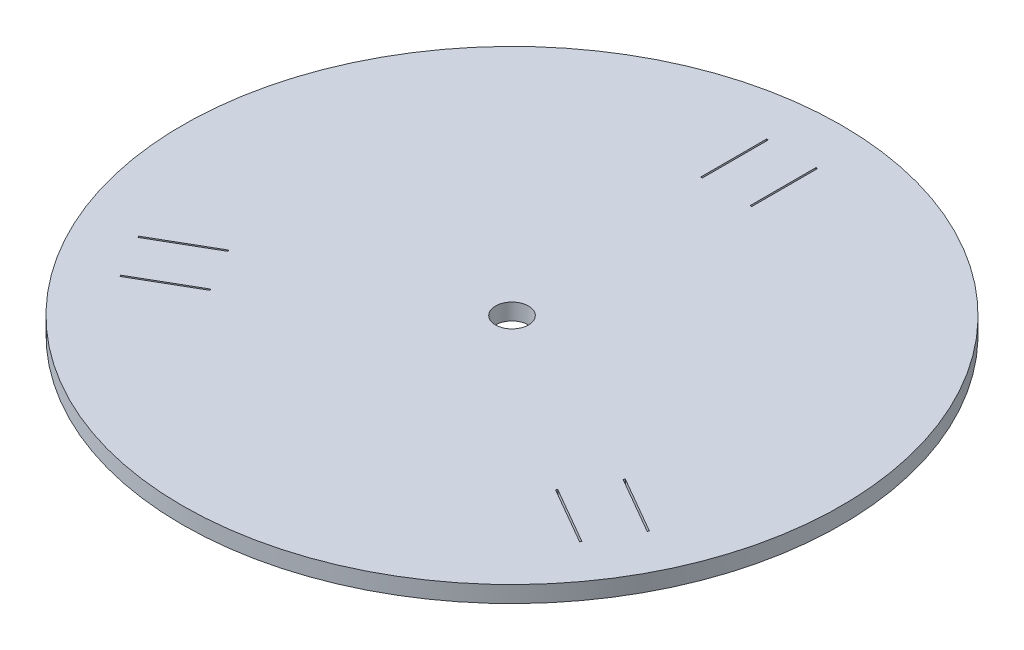
ISO-10303-21;
HEADER;
FILE_DESCRIPTION(('STEP AP214'),'2;1');
FILE_NAME('part.step','',(''),(''),'','','');
FILE_SCHEMA(('AUTOMOTIVE_DESIGN { 1 0 10303 214 1 1 1 1 }'));
ENDSEC;
DATA;
#1=APPLICATION_CONTEXT('core data for automotive mechanical design processes');
#2=APPLICATION_PROTOCOL_DEFINITION('international standard','automotive_design',2000,#1);
#3=PRODUCT_CONTEXT('',#1,'mechanical');
#4=PRODUCT('Part','Part','',(#3));
#5=PRODUCT_RELATED_PRODUCT_CATEGORY('part','',(#4));
#6=PRODUCT_DEFINITION_FORMATION('','',#4);
#7=PRODUCT_DEFINITION_CONTEXT('part definition',#1,'design');
#8=PRODUCT_DEFINITION('design','',#6,#7);
#9=PRODUCT_DEFINITION_SHAPE('','',#8);
#10=(LENGTH_UNIT() NAMED_UNIT(*) SI_UNIT(.MILLI.,.METRE.));
#11=(NAMED_UNIT(*) PLANE_ANGLE_UNIT() SI_UNIT($,.RADIAN.));
#12=(NAMED_UNIT(*) SI_UNIT($,.STERADIAN.) SOLID_ANGLE_UNIT());
#13=UNCERTAINTY_MEASURE_WITH_UNIT(LENGTH_MEASURE(1.E-05),#10,'distance_accuracy_value','');
#14=(GEOMETRIC_REPRESENTATION_CONTEXT(3) GLOBAL_UNCERTAINTY_ASSIGNED_CONTEXT((#13)) GLOBAL_UNIT_ASSIGNED_CONTEXT((#10,
#11,#12)) REPRESENTATION_CONTEXT('',''));
#15=CARTESIAN_POINT('',(0.,0.,0.));
#16=DIRECTION('',(0.,0.,1.));
#17=DIRECTION('',(1.,0.,0.));
#18=AXIS2_PLACEMENT_3D('',#15,#16,#17);
#19=CARTESIAN_POINT('',(0.,5.,0.));
#20=DIRECTION('',(0.,1.,0.));
#21=DIRECTION('',(0.,0.,1.));
#22=AXIS2_PLACEMENT_3D('',#19,#20,#21);
#23=PLANE('',#22);
#24=CARTESIAN_POINT('',(0.,5.,0.));
#25=DIRECTION('',(0.,1.,0.));
#26=DIRECTION('',(0.,0.,1.));
#27=AXIS2_PLACEMENT_3D('',#24,#25,#26);
#28=CIRCLE('',#27,100.);
#29=CARTESIAN_POINT('',(0.,5.,100.));
#30=VERTEX_POINT('',#29);
#31=EDGE_CURVE('E11',#30,#30,#28,.T.);
#32=ORIENTED_EDGE('',*,*,#31,.T.);
#33=EDGE_LOOP('',(#32));
#34=FACE_BOUND('',#33,.T.);
#35=DIRECTION('',(0.500000000000005,0.,-0.866025403784436));
#36=VECTOR('',#35,1.);
#37=CARTESIAN_POINT('',(77.4871593216773,5.,35.7883031206706));
#38=LINE('',#37,#36);
#39=CARTESIAN_POINT('',(77.2371593216773,5.,36.2213158225628));
#40=VERTEX_POINT('',#39);
#41=CARTESIAN_POINT('',(77.4871593216773,5.,35.7883031206706));
#42=VERTEX_POINT('',#41);
#43=EDGE_CURVE('E264',#40,#42,#38,.T.);
#44=ORIENTED_EDGE('',*,*,#43,.F.);
#45=DIRECTION('',(0.866025403784439,0.,0.5));
#46=VECTOR('',#45,1.);
#47=CARTESIAN_POINT('',(59.9166512459885,5.,26.2213158225628));
#48=LINE('',#47,#46);
#49=CARTESIAN_POINT('',(59.9166512459885,5.,26.2213158225628));
#50=VERTEX_POINT('',#49);
#51=EDGE_CURVE('E370',#50,#40,#48,.T.);
#52=ORIENTED_EDGE('',*,*,#51,.F.);
#53=DIRECTION('',(-0.500000000000002,0.,0.866025403784438));
#54=VECTOR('',#53,1.);
#55=CARTESIAN_POINT('',(60.1666512459885,5.,25.7883031206706));
#56=LINE('',#55,#54);
#57=CARTESIAN_POINT('',(60.1666512459885,5.,25.7883031206706));
#58=VERTEX_POINT('',#57);
#59=EDGE_CURVE('E384',#58,#50,#56,.T.);
#60=ORIENTED_EDGE('',*,*,#59,.F.);
#61=DIRECTION('',(-0.866025403784439,0.,-0.5));
#62=VECTOR('',#61,1.);
#63=CARTESIAN_POINT('',(60.1666512459885,5.,25.7883031206706));
#64=LINE('',#63,#62);
#65=EDGE_CURVE('E381',#42,#58,#64,.T.);
#66=ORIENTED_EDGE('',*,*,#65,.F.);
#67=EDGE_LOOP('',(#44,#52,#60,#66));
#68=FACE_BOUND('',#67,.T.);
#69=DIRECTION('',(0.499999999999998,0.,0.866025403784439));
#70=VECTOR('',#69,1.);
#71=CARTESIAN_POINT('',(-77.2371593216773,5.,36.2213158225629));
#72=LINE('',#71,#70);
#73=CARTESIAN_POINT('',(-77.4871593216773,5.,35.7883031206706));
#74=VERTEX_POINT('',#73);
#75=CARTESIAN_POINT('',(-77.2371593216773,5.,36.2213158225629));
#76=VERTEX_POINT('',#75);
#77=EDGE_CURVE('E205',#74,#76,#72,.T.);
#78=ORIENTED_EDGE('',*,*,#77,.F.);
#79=DIRECTION('',(-0.866025403784438,0.,0.5));
#80=VECTOR('',#79,1.);
#81=CARTESIAN_POINT('',(-60.1666512459885,5.,25.7883031206706));
#82=LINE('',#81,#80);
#83=CARTESIAN_POINT('',(-60.1666512459885,5.,25.7883031206706));
#84=VERTEX_POINT('',#83);
#85=EDGE_CURVE('E216',#84,#74,#82,.T.);
#86=ORIENTED_EDGE('',*,*,#85,.F.);
#87=DIRECTION('',(-0.500000000000002,0.,-0.866025403784438));
#88=VECTOR('',#87,1.);
#89=CARTESIAN_POINT('',(-59.9166512459885,5.,26.2213158225629));
#90=LINE('',#89,#88);
#91=CARTESIAN_POINT('',(-59.9166512459885,5.,26.2213158225629));
#92=VERTEX_POINT('',#91);
#93=EDGE_CURVE('E221',#92,#84,#90,.T.);
#94=ORIENTED_EDGE('',*,*,#93,.F.);
#95=DIRECTION('',(0.866025403784438,0.,-0.5));
#96=VECTOR('',#95,1.);
#97=CARTESIAN_POINT('',(-59.9166512459885,5.,26.2213158225629));
#98=LINE('',#97,#96);
#99=EDGE_CURVE('E226',#76,#92,#98,.T.);
#100=ORIENTED_EDGE('',*,*,#99,.F.);
#101=EDGE_LOOP('',(#78,#86,#94,#100));
#102=FACE_BOUND('',#101,.T.);
#103=DIRECTION('',(0.499999999999998,0.,0.866025403784439));
#104=VECTOR('',#103,1.);
#105=CARTESIAN_POINT('',(-69.7371593216772,5.,49.2116968793294));
#106=LINE('',#105,#104);
#107=CARTESIAN_POINT('',(-69.9871593216772,5.,48.7786841774372));
#108=VERTEX_POINT('',#107);
#109=CARTESIAN_POINT('',(-69.7371593216772,5.,49.2116968793294));
#110=VERTEX_POINT('',#109);
#111=EDGE_CURVE('E316',#108,#110,#106,.T.);
#112=ORIENTED_EDGE('',*,*,#111,.F.);
#113=DIRECTION('',(-0.866025403784438,0.,0.5));
#114=VECTOR('',#113,1.);
#115=CARTESIAN_POINT('',(-52.6666512459885,5.,38.7786841774372));
#116=LINE('',#115,#114);
#117=CARTESIAN_POINT('',(-52.6666512459885,5.,38.7786841774372));
#118=VERTEX_POINT('',#117);
#119=EDGE_CURVE('E345',#118,#108,#116,.T.);
#120=ORIENTED_EDGE('',*,*,#119,.F.);
#121=DIRECTION('',(-0.499999999999998,0.,-0.866025403784439));
#122=VECTOR('',#121,1.);
#123=CARTESIAN_POINT('',(-52.4166512459885,5.,39.2116968793294));
#124=LINE('',#123,#122);
#125=CARTESIAN_POINT('',(-52.4166512459885,5.,39.2116968793294));
#126=VERTEX_POINT('',#125);
#127=EDGE_CURVE('E348',#126,#118,#124,.T.);
#128=ORIENTED_EDGE('',*,*,#127,.F.);
#129=DIRECTION('',(0.866025403784438,0.,-0.5));
#130=VECTOR('',#129,1.);
#131=CARTESIAN_POINT('',(-52.4166512459885,5.,39.2116968793294));
#132=LINE('',#131,#130);
#133=EDGE_CURVE('E352',#110,#126,#132,.T.);
#134=ORIENTED_EDGE('',*,*,#133,.F.);
#135=EDGE_LOOP('',(#112,#120,#128,#134));
#136=FACE_BOUND('',#135,.T.);
#137=DIRECTION('',(0.499999999999998,0.,-0.866025403784439));
#138=VECTOR('',#137,1.);
#139=CARTESIAN_POINT('',(69.9871593216773,5.,48.7786841774372));
#140=LINE('',#139,#138);
#141=CARTESIAN_POINT('',(69.7371593216773,5.,49.2116968793294));
#142=VERTEX_POINT('',#141);
#143=CARTESIAN_POINT('',(69.9871593216773,5.,48.7786841774372));
#144=VERTEX_POINT('',#143);
#145=EDGE_CURVE('E284',#142,#144,#140,.T.);
#146=ORIENTED_EDGE('',*,*,#145,.F.);
#147=DIRECTION('',(0.866025403784438,0.,0.5));
#148=VECTOR('',#147,1.);
#149=CARTESIAN_POINT('',(52.4166512459885,5.,39.2116968793294));
#150=LINE('',#149,#148);
#151=CARTESIAN_POINT('',(52.4166512459885,5.,39.2116968793294));
#152=VERTEX_POINT('',#151);
#153=EDGE_CURVE('E317',#152,#142,#150,.T.);
#154=ORIENTED_EDGE('',*,*,#153,.F.);
#155=DIRECTION('',(-0.500000000000005,0.,0.866025403784436));
#156=VECTOR('',#155,1.);
#157=CARTESIAN_POINT('',(52.6666512459885,5.,38.7786841774372));
#158=LINE('',#157,#156);
#159=CARTESIAN_POINT('',(52.6666512459885,5.,38.7786841774372));
#160=VERTEX_POINT('',#159);
#161=EDGE_CURVE('E320',#160,#152,#158,.T.);
#162=ORIENTED_EDGE('',*,*,#161,.F.);
#163=DIRECTION('',(-0.866025403784439,0.,-0.5));
#164=VECTOR('',#163,1.);
#165=CARTESIAN_POINT('',(52.6666512459885,5.,38.7786841774372));
#166=LINE('',#165,#164);
#167=EDGE_CURVE('E324',#144,#160,#166,.T.);
#168=ORIENTED_EDGE('',*,*,#167,.F.);
#169=EDGE_LOOP('',(#146,#154,#162,#168));
#170=FACE_BOUND('',#169,.T.);
#171=DIRECTION('',(0.,0.,-1.));
#172=VECTOR('',#171,1.);
#173=CARTESIAN_POINT('',(7.75,5.,-65.));
#174=LINE('',#173,#172);
#175=CARTESIAN_POINT('',(7.75,5.,-65.));
#176=VERTEX_POINT('',#175);
#177=CARTESIAN_POINT('',(7.75,5.,-85.));
#178=VERTEX_POINT('',#177);
#179=EDGE_CURVE('E64',#176,#178,#174,.T.);
#180=ORIENTED_EDGE('',*,*,#179,.F.);
#181=DIRECTION('',(1.,0.,0.));
#182=VECTOR('',#181,1.);
#183=CARTESIAN_POINT('',(7.25,5.,-65.));
#184=LINE('',#183,#182);
#185=CARTESIAN_POINT('',(7.25,5.,-65.));
#186=VERTEX_POINT('',#185);
#187=EDGE_CURVE('E285',#186,#176,#184,.T.);
#188=ORIENTED_EDGE('',*,*,#187,.F.);
#189=DIRECTION('',(0.,0.,1.));
#190=VECTOR('',#189,1.);
#191=CARTESIAN_POINT('',(7.25,5.,-65.));
#192=LINE('',#191,#190);
#193=CARTESIAN_POINT('',(7.25,5.,-85.));
#194=VERTEX_POINT('',#193);
#195=EDGE_CURVE('E288',#194,#186,#192,.T.);
#196=ORIENTED_EDGE('',*,*,#195,.F.);
#197=DIRECTION('',(-1.,0.,0.));
#198=VECTOR('',#197,1.);
#199=CARTESIAN_POINT('',(7.25,5.,-85.));
#200=LINE('',#199,#198);
#201=EDGE_CURVE('E292',#178,#194,#200,.T.);
#202=ORIENTED_EDGE('',*,*,#201,.F.);
#203=EDGE_LOOP('',(#180,#188,#196,#202));
#204=FACE_BOUND('',#203,.T.);
#205=DIRECTION('',(0.,0.,-1.));
#206=VECTOR('',#205,1.);
#207=CARTESIAN_POINT('',(-7.25,5.,-65.));
#208=LINE('',#207,#206);
#209=CARTESIAN_POINT('',(-7.25,5.,-65.));
#210=VERTEX_POINT('',#209);
#211=CARTESIAN_POINT('',(-7.25,5.,-85.));
#212=VERTEX_POINT('',#211);
#213=EDGE_CURVE('E56',#210,#212,#208,.T.);
#214=ORIENTED_EDGE('',*,*,#213,.F.);
#215=DIRECTION('',(1.,0.,0.));
#216=VECTOR('',#215,1.);
#217=CARTESIAN_POINT('',(-7.75,5.,-65.));
#218=LINE('',#217,#216);
#219=CARTESIAN_POINT('',(-7.75,5.,-65.));
#220=VERTEX_POINT('',#219);
#221=EDGE_CURVE('E253',#220,#210,#218,.T.);
#222=ORIENTED_EDGE('',*,*,#221,.F.);
#223=DIRECTION('',(0.,0.,1.));
#224=VECTOR('',#223,1.);
#225=CARTESIAN_POINT('',(-7.75,5.,-65.));
#226=LINE('',#225,#224);
#227=CARTESIAN_POINT('',(-7.75,5.,-85.));
#228=VERTEX_POINT('',#227);
#229=EDGE_CURVE('E256',#228,#220,#226,.T.);
#230=ORIENTED_EDGE('',*,*,#229,.F.);
#231=DIRECTION('',(-1.,0.,0.));
#232=VECTOR('',#231,1.);
#233=CARTESIAN_POINT('',(-7.75,5.,-85.));
#234=LINE('',#233,#232);
#235=EDGE_CURVE('E260',#212,#228,#234,.T.);
#236=ORIENTED_EDGE('',*,*,#235,.F.);
#237=EDGE_LOOP('',(#214,#222,#230,#236));
#238=FACE_BOUND('',#237,.T.);
#239=CARTESIAN_POINT('',(0.,5.,0.));
#240=DIRECTION('',(0.,-1.,0.));
#241=DIRECTION('',(0.,0.,-1.));
#242=AXIS2_PLACEMENT_3D('',#239,#240,#241);
#243=CIRCLE('',#242,5.);
#244=CARTESIAN_POINT('',(0.,5.,-5.));
#245=VERTEX_POINT('',#244);
#246=EDGE_CURVE('E213',#245,#245,#243,.T.);
#247=ORIENTED_EDGE('',*,*,#246,.T.);
#248=EDGE_LOOP('',(#247));
#249=FACE_BOUND('',#248,.T.);
#250=ADVANCED_FACE('F41',(#34,#68,#102,#136,#170,#204,#238,#249),#23,.T.);
#251=CARTESIAN_POINT('',(0.,5.,0.));
#252=DIRECTION('',(0.,-1.,0.));
#253=DIRECTION('',(0.,0.,-1.));
#254=AXIS2_PLACEMENT_3D('',#251,#252,#253);
#255=CYLINDRICAL_SURFACE('',#254,100.);
#256=ORIENTED_EDGE('',*,*,#31,.F.);
#257=EDGE_LOOP('',(#256));
#258=FACE_BOUND('',#257,.T.);
#259=CARTESIAN_POINT('',(0.,0.,0.));
#260=DIRECTION('',(0.,1.,0.));
#261=DIRECTION('',(0.,0.,1.));
#262=AXIS2_PLACEMENT_3D('',#259,#260,#261);
#263=CIRCLE('',#262,100.);
#264=CARTESIAN_POINT('',(0.,0.,100.));
#265=VERTEX_POINT('',#264);
#266=EDGE_CURVE('E45',#265,#265,#263,.T.);
#267=ORIENTED_EDGE('',*,*,#266,.T.);
#268=EDGE_LOOP('',(#267));
#269=FACE_BOUND('',#268,.T.);
#270=ADVANCED_FACE('F43',(#258,#269),#255,.T.);
#271=CARTESIAN_POINT('',(0.,0.,0.));
#272=DIRECTION('',(0.,1.,0.));
#273=DIRECTION('',(0.,0.,1.));
#274=AXIS2_PLACEMENT_3D('',#271,#272,#273);
#275=PLANE('',#274);
#276=CARTESIAN_POINT('',(0.,0.,0.));
#277=DIRECTION('',(0.,-1.,0.));
#278=DIRECTION('',(0.,0.,-1.));
#279=AXIS2_PLACEMENT_3D('',#276,#277,#278);
#280=CIRCLE('',#279,5.025);
#281=CARTESIAN_POINT('',(0.,0.,-5.025));
#282=VERTEX_POINT('',#281);
#283=EDGE_CURVE('E442',#282,#282,#280,.T.);
#284=ORIENTED_EDGE('',*,*,#283,.F.);
#285=EDGE_LOOP('',(#284));
#286=FACE_BOUND('',#285,.T.);
#287=DIRECTION('',(1.,0.,0.));
#288=VECTOR('',#287,1.);
#289=CARTESIAN_POINT('',(-7.75,0.,-65.));
#290=LINE('',#289,#288);
#291=CARTESIAN_POINT('',(-7.75,0.,-65.));
#292=VERTEX_POINT('',#291);
#293=CARTESIAN_POINT('',(-7.25,0.,-65.));
#294=VERTEX_POINT('',#293);
#295=EDGE_CURVE('E246',#292,#294,#290,.T.);
#296=ORIENTED_EDGE('',*,*,#295,.T.);
#297=DIRECTION('',(0.,0.,-1.));
#298=VECTOR('',#297,1.);
#299=CARTESIAN_POINT('',(-7.25,0.,-65.));
#300=LINE('',#299,#298);
#301=CARTESIAN_POINT('',(-7.25,0.,-85.));
#302=VERTEX_POINT('',#301);
#303=EDGE_CURVE('E257',#294,#302,#300,.T.);
#304=ORIENTED_EDGE('',*,*,#303,.T.);
#305=DIRECTION('',(-1.,0.,0.));
#306=VECTOR('',#305,1.);
#307=CARTESIAN_POINT('',(-7.75,0.,-85.));
#308=LINE('',#307,#306);
#309=CARTESIAN_POINT('',(-7.75,0.,-85.));
#310=VERTEX_POINT('',#309);
#311=EDGE_CURVE('E270',#302,#310,#308,.T.);
#312=ORIENTED_EDGE('',*,*,#311,.T.);
#313=DIRECTION('',(0.,0.,1.));
#314=VECTOR('',#313,1.);
#315=CARTESIAN_POINT('',(-7.75,0.,-65.));
#316=LINE('',#315,#314);
#317=EDGE_CURVE('E267',#310,#292,#316,.T.);
#318=ORIENTED_EDGE('',*,*,#317,.T.);
#319=EDGE_LOOP('',(#296,#304,#312,#318));
#320=FACE_BOUND('',#319,.T.);
#321=DIRECTION('',(1.,0.,0.));
#322=VECTOR('',#321,1.);
#323=CARTESIAN_POINT('',(7.25,0.,-65.));
#324=LINE('',#323,#322);
#325=CARTESIAN_POINT('',(7.25,0.,-65.));
#326=VERTEX_POINT('',#325);
#327=CARTESIAN_POINT('',(7.75,0.,-65.));
#328=VERTEX_POINT('',#327);
#329=EDGE_CURVE('E277',#326,#328,#324,.T.);
#330=ORIENTED_EDGE('',*,*,#329,.T.);
#331=DIRECTION('',(0.,0.,-1.));
#332=VECTOR('',#331,1.);
#333=CARTESIAN_POINT('',(7.75,0.,-65.));
#334=LINE('',#333,#332);
#335=CARTESIAN_POINT('',(7.75,0.,-85.));
#336=VERTEX_POINT('',#335);
#337=EDGE_CURVE('E289',#328,#336,#334,.T.);
#338=ORIENTED_EDGE('',*,*,#337,.T.);
#339=DIRECTION('',(-1.,0.,0.));
#340=VECTOR('',#339,1.);
#341=CARTESIAN_POINT('',(7.25,0.,-85.));
#342=LINE('',#341,#340);
#343=CARTESIAN_POINT('',(7.25,0.,-85.));
#344=VERTEX_POINT('',#343);
#345=EDGE_CURVE('E301',#336,#344,#342,.T.);
#346=ORIENTED_EDGE('',*,*,#345,.T.);
#347=DIRECTION('',(0.,0.,1.));
#348=VECTOR('',#347,1.);
#349=CARTESIAN_POINT('',(7.25,0.,-65.));
#350=LINE('',#349,#348);
#351=EDGE_CURVE('E298',#344,#326,#350,.T.);
#352=ORIENTED_EDGE('',*,*,#351,.T.);
#353=EDGE_LOOP('',(#330,#338,#346,#352));
#354=FACE_BOUND('',#353,.T.);
#355=DIRECTION('',(0.866025403784438,0.,0.5));
#356=VECTOR('',#355,1.);
#357=CARTESIAN_POINT('',(52.4166512459885,0.,39.2116968793294));
#358=LINE('',#357,#356);
#359=CARTESIAN_POINT('',(52.4166512459885,0.,39.2116968793294));
#360=VERTEX_POINT('',#359);
#361=CARTESIAN_POINT('',(69.7371593216773,0.,49.2116968793294));
#362=VERTEX_POINT('',#361);
#363=EDGE_CURVE('E309',#360,#362,#358,.T.);
#364=ORIENTED_EDGE('',*,*,#363,.T.);
#365=DIRECTION('',(0.499999999999998,0.,-0.866025403784439));
#366=VECTOR('',#365,1.);
#367=CARTESIAN_POINT('',(69.9871593216773,0.,48.7786841774372));
#368=LINE('',#367,#366);
#369=CARTESIAN_POINT('',(69.9871593216773,0.,48.7786841774372));
#370=VERTEX_POINT('',#369);
#371=EDGE_CURVE('E321',#362,#370,#368,.T.);
#372=ORIENTED_EDGE('',*,*,#371,.T.);
#373=DIRECTION('',(-0.866025403784439,0.,-0.5));
#374=VECTOR('',#373,1.);
#375=CARTESIAN_POINT('',(52.6666512459885,0.,38.7786841774372));
#376=LINE('',#375,#374);
#377=CARTESIAN_POINT('',(52.6666512459885,0.,38.7786841774372));
#378=VERTEX_POINT('',#377);
#379=EDGE_CURVE('E333',#370,#378,#376,.T.);
#380=ORIENTED_EDGE('',*,*,#379,.T.);
#381=DIRECTION('',(-0.500000000000005,0.,0.866025403784436));
#382=VECTOR('',#381,1.);
#383=CARTESIAN_POINT('',(52.6666512459885,0.,38.7786841774372));
#384=LINE('',#383,#382);
#385=EDGE_CURVE('E330',#378,#360,#384,.T.);
#386=ORIENTED_EDGE('',*,*,#385,.T.);
#387=EDGE_LOOP('',(#364,#372,#380,#386));
#388=FACE_BOUND('',#387,.T.);
#389=DIRECTION('',(-0.866025403784438,0.,0.5));
#390=VECTOR('',#389,1.);
#391=CARTESIAN_POINT('',(-52.6666512459885,0.,38.7786841774372));
#392=LINE('',#391,#390);
#393=CARTESIAN_POINT('',(-52.6666512459885,0.,38.7786841774372));
#394=VERTEX_POINT('',#393);
#395=CARTESIAN_POINT('',(-69.9871593216772,0.,48.7786841774372));
#396=VERTEX_POINT('',#395);
#397=EDGE_CURVE('E341',#394,#396,#392,.T.);
#398=ORIENTED_EDGE('',*,*,#397,.T.);
#399=DIRECTION('',(0.499999999999998,0.,0.866025403784439));
#400=VECTOR('',#399,1.);
#401=CARTESIAN_POINT('',(-69.7371593216772,0.,49.2116968793294));
#402=LINE('',#401,#400);
#403=CARTESIAN_POINT('',(-69.7371593216772,0.,49.2116968793294));
#404=VERTEX_POINT('',#403);
#405=EDGE_CURVE('E349',#396,#404,#402,.T.);
#406=ORIENTED_EDGE('',*,*,#405,.T.);
#407=DIRECTION('',(0.866025403784438,0.,-0.5));
#408=VECTOR('',#407,1.);
#409=CARTESIAN_POINT('',(-52.4166512459885,0.,39.2116968793294));
#410=LINE('',#409,#408);
#411=CARTESIAN_POINT('',(-52.4166512459885,0.,39.2116968793294));
#412=VERTEX_POINT('',#411);
#413=EDGE_CURVE('E361',#404,#412,#410,.T.);
#414=ORIENTED_EDGE('',*,*,#413,.T.);
#415=DIRECTION('',(-0.499999999999998,0.,-0.866025403784439));
#416=VECTOR('',#415,1.);
#417=CARTESIAN_POINT('',(-52.4166512459885,0.,39.2116968793294));
#418=LINE('',#417,#416);
#419=EDGE_CURVE('E358',#412,#394,#418,.T.);
#420=ORIENTED_EDGE('',*,*,#419,.T.);
#421=EDGE_LOOP('',(#398,#406,#414,#420));
#422=FACE_BOUND('',#421,.T.);
#423=DIRECTION('',(-0.866025403784438,0.,0.5));
#424=VECTOR('',#423,1.);
#425=CARTESIAN_POINT('',(-60.1666512459885,0.,25.7883031206706));
#426=LINE('',#425,#424);
#427=CARTESIAN_POINT('',(-60.1666512459885,0.,25.7883031206706));
#428=VERTEX_POINT('',#427);
#429=CARTESIAN_POINT('',(-77.4871593216773,0.,35.7883031206706));
#430=VERTEX_POINT('',#429);
#431=EDGE_CURVE('E234',#428,#430,#426,.T.);
#432=ORIENTED_EDGE('',*,*,#431,.T.);
#433=DIRECTION('',(0.499999999999998,0.,0.866025403784439));
#434=VECTOR('',#433,1.);
#435=CARTESIAN_POINT('',(-77.2371593216773,0.,36.2213158225629));
#436=LINE('',#435,#434);
#437=CARTESIAN_POINT('',(-77.2371593216773,0.,36.2213158225629));
#438=VERTEX_POINT('',#437);
#439=EDGE_CURVE('E208',#430,#438,#436,.T.);
#440=ORIENTED_EDGE('',*,*,#439,.T.);
#441=DIRECTION('',(0.866025403784438,0.,-0.5));
#442=VECTOR('',#441,1.);
#443=CARTESIAN_POINT('',(-59.9166512459885,0.,26.2213158225629));
#444=LINE('',#443,#442);
#445=CARTESIAN_POINT('',(-59.9166512459885,0.,26.2213158225628));
#446=VERTEX_POINT('',#445);
#447=EDGE_CURVE('E240',#438,#446,#444,.T.);
#448=ORIENTED_EDGE('',*,*,#447,.T.);
#449=DIRECTION('',(-0.500000000000002,0.,-0.866025403784438));
#450=VECTOR('',#449,1.);
#451=CARTESIAN_POINT('',(-59.9166512459885,0.,26.2213158225629));
#452=LINE('',#451,#450);
#453=EDGE_CURVE('E236',#446,#428,#452,.T.);
#454=ORIENTED_EDGE('',*,*,#453,.T.);
#455=EDGE_LOOP('',(#432,#440,#448,#454));
#456=FACE_BOUND('',#455,.T.);
#457=DIRECTION('',(0.866025403784439,0.,0.5));
#458=VECTOR('',#457,1.);
#459=CARTESIAN_POINT('',(59.9166512459885,0.,26.2213158225628));
#460=LINE('',#459,#458);
#461=CARTESIAN_POINT('',(59.9166512459885,0.,26.2213158225628));
#462=VERTEX_POINT('',#461);
#463=CARTESIAN_POINT('',(77.2371593216773,0.,36.2213158225628));
#464=VERTEX_POINT('',#463);
#465=EDGE_CURVE('E376',#462,#464,#460,.T.);
#466=ORIENTED_EDGE('',*,*,#465,.T.);
#467=DIRECTION('',(0.500000000000005,0.,-0.866025403784436));
#468=VECTOR('',#467,1.);
#469=CARTESIAN_POINT('',(77.4871593216773,0.,35.7883031206706));
#470=LINE('',#469,#468);
#471=CARTESIAN_POINT('',(77.4871593216773,0.,35.7883031206706));
#472=VERTEX_POINT('',#471);
#473=EDGE_CURVE('E366',#464,#472,#470,.T.);
#474=ORIENTED_EDGE('',*,*,#473,.T.);
#475=DIRECTION('',(-0.866025403784439,0.,-0.5));
#476=VECTOR('',#475,1.);
#477=CARTESIAN_POINT('',(60.1666512459885,0.,25.7883031206706));
#478=LINE('',#477,#476);
#479=CARTESIAN_POINT('',(60.1666512459885,0.,25.7883031206706));
#480=VERTEX_POINT('',#479);
#481=EDGE_CURVE('E369',#472,#480,#478,.T.);
#482=ORIENTED_EDGE('',*,*,#481,.T.);
#483=DIRECTION('',(-0.500000000000002,0.,0.866025403784438));
#484=VECTOR('',#483,1.);
#485=CARTESIAN_POINT('',(60.1666512459885,0.,25.7883031206706));
#486=LINE('',#485,#484);
#487=EDGE_CURVE('E373',#480,#462,#486,.T.);
#488=ORIENTED_EDGE('',*,*,#487,.T.);
#489=EDGE_LOOP('',(#466,#474,#482,#488));
#490=FACE_BOUND('',#489,.T.);
#491=ORIENTED_EDGE('',*,*,#266,.F.);
#492=EDGE_LOOP('',(#491));
#493=FACE_BOUND('',#492,.T.);
#494=ADVANCED_FACE('F411',(#286,#320,#354,#388,#422,#456,#490,#493),#275,.F.);
#495=CARTESIAN_POINT('',(77.4871593216773,0.,35.7883031206706));
#496=DIRECTION('',(0.866025403784436,0.,0.500000000000005));
#497=DIRECTION('',(0.500000000000005,0.,-0.866025403784436));
#498=AXIS2_PLACEMENT_3D('',#495,#496,#497);
#499=PLANE('',#498);
#500=ORIENTED_EDGE('',*,*,#43,.T.);
#501=DIRECTION('',(0.,1.,0.));
#502=VECTOR('',#501,1.);
#503=CARTESIAN_POINT('',(77.4871593216773,0.,35.7883031206706));
#504=LINE('',#503,#502);
#505=EDGE_CURVE('E379',#472,#42,#504,.T.);
#506=ORIENTED_EDGE('',*,*,#505,.F.);
#507=ORIENTED_EDGE('',*,*,#473,.F.);
#508=DIRECTION('',(0.,1.,0.));
#509=VECTOR('',#508,1.);
#510=CARTESIAN_POINT('',(77.2371593216773,0.,36.2213158225628));
#511=LINE('',#510,#509);
#512=EDGE_CURVE('E389',#464,#40,#511,.T.);
#513=ORIENTED_EDGE('',*,*,#512,.T.);
#514=EDGE_LOOP('',(#500,#506,#507,#513));
#515=FACE_BOUND('',#514,.T.);
#516=ADVANCED_FACE('F413',(#515),#499,.F.);
#517=CARTESIAN_POINT('',(59.9166512459885,0.,26.2213158225628));
#518=DIRECTION('',(-0.5,0.,0.866025403784439));
#519=DIRECTION('',(0.866025403784439,0.,0.5));
#520=AXIS2_PLACEMENT_3D('',#517,#518,#519);
#521=PLANE('',#520);
#522=ORIENTED_EDGE('',*,*,#51,.T.);
#523=ORIENTED_EDGE('',*,*,#512,.F.);
#524=ORIENTED_EDGE('',*,*,#465,.F.);
#525=DIRECTION('',(0.,1.,0.));
#526=VECTOR('',#525,1.);
#527=CARTESIAN_POINT('',(59.9166512459885,0.,26.2213158225628));
#528=LINE('',#527,#526);
#529=EDGE_CURVE('E391',#462,#50,#528,.T.);
#530=ORIENTED_EDGE('',*,*,#529,.T.);
#531=EDGE_LOOP('',(#522,#523,#524,#530));
#532=FACE_BOUND('',#531,.T.);
#533=ADVANCED_FACE('F415',(#532),#521,.F.);
#534=CARTESIAN_POINT('',(60.1666512459885,0.,25.7883031206706));
#535=DIRECTION('',(-0.866025403784438,0.,-0.500000000000002));
#536=DIRECTION('',(-0.500000000000002,0.,0.866025403784438));
#537=AXIS2_PLACEMENT_3D('',#534,#535,#536);
#538=PLANE('',#537);
#539=ORIENTED_EDGE('',*,*,#59,.T.);
#540=ORIENTED_EDGE('',*,*,#529,.F.);
#541=ORIENTED_EDGE('',*,*,#487,.F.);
#542=DIRECTION('',(0.,1.,0.));
#543=VECTOR('',#542,1.);
#544=CARTESIAN_POINT('',(60.1666512459885,0.,25.7883031206706));
#545=LINE('',#544,#543);
#546=EDGE_CURVE('E393',#480,#58,#545,.T.);
#547=ORIENTED_EDGE('',*,*,#546,.T.);
#548=EDGE_LOOP('',(#539,#540,#541,#547));
#549=FACE_BOUND('',#548,.T.);
#550=ADVANCED_FACE('F408',(#549),#538,.F.);
#551=CARTESIAN_POINT('',(60.1666512459885,0.,25.7883031206706));
#552=DIRECTION('',(0.5,0.,-0.866025403784439));
#553=DIRECTION('',(-0.866025403784439,0.,-0.5));
#554=AXIS2_PLACEMENT_3D('',#551,#552,#553);
#555=PLANE('',#554);
#556=ORIENTED_EDGE('',*,*,#65,.T.);
#557=ORIENTED_EDGE('',*,*,#546,.F.);
#558=ORIENTED_EDGE('',*,*,#481,.F.);
#559=ORIENTED_EDGE('',*,*,#505,.T.);
#560=EDGE_LOOP('',(#556,#557,#558,#559));
#561=FACE_BOUND('',#560,.T.);
#562=ADVANCED_FACE('F399',(#561),#555,.F.);
#563=CARTESIAN_POINT('',(-77.2371593216773,0.,36.2213158225629));
#564=DIRECTION('',(-0.866025403784439,0.,0.499999999999999));
#565=DIRECTION('',(0.499999999999999,0.,0.866025403784439));
#566=AXIS2_PLACEMENT_3D('',#563,#564,#565);
#567=PLANE('',#566);
#568=ORIENTED_EDGE('',*,*,#77,.T.);
#569=DIRECTION('',(0.,1.,0.));
#570=VECTOR('',#569,1.);
#571=CARTESIAN_POINT('',(-77.2371593216773,0.,36.2213158225629));
#572=LINE('',#571,#570);
#573=EDGE_CURVE('E237',#438,#76,#572,.T.);
#574=ORIENTED_EDGE('',*,*,#573,.F.);
#575=ORIENTED_EDGE('',*,*,#439,.F.);
#576=DIRECTION('',(0.,1.,0.));
#577=VECTOR('',#576,1.);
#578=CARTESIAN_POINT('',(-77.4871593216773,0.,35.7883031206706));
#579=LINE('',#578,#577);
#580=EDGE_CURVE('E201',#430,#74,#579,.T.);
#581=ORIENTED_EDGE('',*,*,#580,.T.);
#582=EDGE_LOOP('',(#568,#574,#575,#581));
#583=FACE_BOUND('',#582,.T.);
#584=ADVANCED_FACE('F203',(#583),#567,.F.);
#585=CARTESIAN_POINT('',(-60.1666512459885,0.,25.7883031206706));
#586=DIRECTION('',(-0.5,0.,-0.866025403784438));
#587=DIRECTION('',(-0.866025403784438,0.,0.5));
#588=AXIS2_PLACEMENT_3D('',#585,#586,#587);
#589=PLANE('',#588);
#590=ORIENTED_EDGE('',*,*,#85,.T.);
#591=ORIENTED_EDGE('',*,*,#580,.F.);
#592=ORIENTED_EDGE('',*,*,#431,.F.);
#593=DIRECTION('',(0.,1.,0.));
#594=VECTOR('',#593,1.);
#595=CARTESIAN_POINT('',(-60.1666512459885,0.,25.7883031206706));
#596=LINE('',#595,#594);
#597=EDGE_CURVE('E212',#428,#84,#596,.T.);
#598=ORIENTED_EDGE('',*,*,#597,.T.);
#599=EDGE_LOOP('',(#590,#591,#592,#598));
#600=FACE_BOUND('',#599,.T.);
#601=ADVANCED_FACE('F217',(#600),#589,.F.);
#602=CARTESIAN_POINT('',(-59.9166512459885,0.,26.2213158225629));
#603=DIRECTION('',(0.866025403784438,0.,-0.500000000000002));
#604=DIRECTION('',(-0.500000000000002,0.,-0.866025403784438));
#605=AXIS2_PLACEMENT_3D('',#602,#603,#604);
#606=PLANE('',#605);
#607=ORIENTED_EDGE('',*,*,#93,.T.);
#608=ORIENTED_EDGE('',*,*,#597,.F.);
#609=ORIENTED_EDGE('',*,*,#453,.F.);
#610=DIRECTION('',(0.,1.,0.));
#611=VECTOR('',#610,1.);
#612=CARTESIAN_POINT('',(-59.9166512459885,0.,26.2213158225629));
#613=LINE('',#612,#611);
#614=EDGE_CURVE('E455',#446,#92,#613,.T.);
#615=ORIENTED_EDGE('',*,*,#614,.T.);
#616=EDGE_LOOP('',(#607,#608,#609,#615));
#617=FACE_BOUND('',#616,.T.);
#618=ADVANCED_FACE('F454',(#617),#606,.F.);
#619=CARTESIAN_POINT('',(-59.9166512459885,0.,26.2213158225629));
#620=DIRECTION('',(0.5,0.,0.866025403784438));
#621=DIRECTION('',(0.866025403784438,0.,-0.500000000000001));
#622=AXIS2_PLACEMENT_3D('',#619,#620,#621);
#623=PLANE('',#622);
#624=ORIENTED_EDGE('',*,*,#99,.T.);
#625=ORIENTED_EDGE('',*,*,#614,.F.);
#626=ORIENTED_EDGE('',*,*,#447,.F.);
#627=ORIENTED_EDGE('',*,*,#573,.T.);
#628=EDGE_LOOP('',(#624,#625,#626,#627));
#629=FACE_BOUND('',#628,.T.);
#630=ADVANCED_FACE('F457',(#629),#623,.F.);
#631=CARTESIAN_POINT('',(-69.7371593216772,0.,49.2116968793294));
#632=DIRECTION('',(-0.866025403784439,0.,0.499999999999999));
#633=DIRECTION('',(0.499999999999999,0.,0.866025403784439));
#634=AXIS2_PLACEMENT_3D('',#631,#632,#633);
#635=PLANE('',#634);
#636=ORIENTED_EDGE('',*,*,#111,.T.);
#637=DIRECTION('',(0.,1.,0.));
#638=VECTOR('',#637,1.);
#639=CARTESIAN_POINT('',(-69.7371593216772,0.,49.2116968793294));
#640=LINE('',#639,#638);
#641=EDGE_CURVE('E338',#404,#110,#640,.T.);
#642=ORIENTED_EDGE('',*,*,#641,.F.);
#643=ORIENTED_EDGE('',*,*,#405,.F.);
#644=DIRECTION('',(0.,1.,0.));
#645=VECTOR('',#644,1.);
#646=CARTESIAN_POINT('',(-69.9871593216772,0.,48.7786841774372));
#647=LINE('',#646,#645);
#648=EDGE_CURVE('E227',#396,#108,#647,.T.);
#649=ORIENTED_EDGE('',*,*,#648,.T.);
#650=EDGE_LOOP('',(#636,#642,#643,#649));
#651=FACE_BOUND('',#650,.T.);
#652=ADVANCED_FACE('F484',(#651),#635,.F.);
#653=CARTESIAN_POINT('',(-52.6666512459885,0.,38.7786841774372));
#654=DIRECTION('',(-0.5,0.,-0.866025403784438));
#655=DIRECTION('',(-0.866025403784438,0.,0.500000000000001));
#656=AXIS2_PLACEMENT_3D('',#653,#654,#655);
#657=PLANE('',#656);
#658=ORIENTED_EDGE('',*,*,#119,.T.);
#659=ORIENTED_EDGE('',*,*,#648,.F.);
#660=ORIENTED_EDGE('',*,*,#397,.F.);
#661=DIRECTION('',(0.,1.,0.));
#662=VECTOR('',#661,1.);
#663=CARTESIAN_POINT('',(-52.6666512459885,0.,38.7786841774372));
#664=LINE('',#663,#662);
#665=EDGE_CURVE('E229',#394,#118,#664,.T.);
#666=ORIENTED_EDGE('',*,*,#665,.T.);
#667=EDGE_LOOP('',(#658,#659,#660,#666));
#668=FACE_BOUND('',#667,.T.);
#669=ADVANCED_FACE('F536',(#668),#657,.F.);
#670=CARTESIAN_POINT('',(-52.4166512459885,0.,39.2116968793294));
#671=DIRECTION('',(0.866025403784439,0.,-0.499999999999999));
#672=DIRECTION('',(-0.499999999999999,0.,-0.866025403784439));
#673=AXIS2_PLACEMENT_3D('',#670,#671,#672);
#674=PLANE('',#673);
#675=ORIENTED_EDGE('',*,*,#127,.T.);
#676=ORIENTED_EDGE('',*,*,#665,.F.);
#677=ORIENTED_EDGE('',*,*,#419,.F.);
#678=DIRECTION('',(0.,1.,0.));
#679=VECTOR('',#678,1.);
#680=CARTESIAN_POINT('',(-52.4166512459885,0.,39.2116968793294));
#681=LINE('',#680,#679);
#682=EDGE_CURVE('E342',#412,#126,#681,.T.);
#683=ORIENTED_EDGE('',*,*,#682,.T.);
#684=EDGE_LOOP('',(#675,#676,#677,#683));
#685=FACE_BOUND('',#684,.T.);
#686=ADVANCED_FACE('F540',(#685),#674,.F.);
#687=CARTESIAN_POINT('',(-52.4166512459885,0.,39.2116968793294));
#688=DIRECTION('',(0.5,0.,0.866025403784438));
#689=DIRECTION('',(0.866025403784438,0.,-0.500000000000001));
#690=AXIS2_PLACEMENT_3D('',#687,#688,#689);
#691=PLANE('',#690);
#692=ORIENTED_EDGE('',*,*,#133,.T.);
#693=ORIENTED_EDGE('',*,*,#682,.F.);
#694=ORIENTED_EDGE('',*,*,#413,.F.);
#695=ORIENTED_EDGE('',*,*,#641,.T.);
#696=EDGE_LOOP('',(#692,#693,#694,#695));
#697=FACE_BOUND('',#696,.T.);
#698=ADVANCED_FACE('F522',(#697),#691,.F.);
#699=CARTESIAN_POINT('',(69.9871593216773,0.,48.7786841774372));
#700=DIRECTION('',(0.866025403784439,0.,0.499999999999999));
#701=DIRECTION('',(0.499999999999999,0.,-0.866025403784439));
#702=AXIS2_PLACEMENT_3D('',#699,#700,#701);
#703=PLANE('',#702);
#704=ORIENTED_EDGE('',*,*,#145,.T.);
#705=DIRECTION('',(0.,1.,0.));
#706=VECTOR('',#705,1.);
#707=CARTESIAN_POINT('',(69.9871593216773,0.,48.7786841774372));
#708=LINE('',#707,#706);
#709=EDGE_CURVE('E306',#370,#144,#708,.T.);
#710=ORIENTED_EDGE('',*,*,#709,.F.);
#711=ORIENTED_EDGE('',*,*,#371,.F.);
#712=DIRECTION('',(0.,1.,0.));
#713=VECTOR('',#712,1.);
#714=CARTESIAN_POINT('',(69.7371593216773,0.,49.2116968793294));
#715=LINE('',#714,#713);
#716=EDGE_CURVE('E314',#362,#142,#715,.T.);
#717=ORIENTED_EDGE('',*,*,#716,.T.);
#718=EDGE_LOOP('',(#704,#710,#711,#717));
#719=FACE_BOUND('',#718,.T.);
#720=ADVANCED_FACE('F518',(#719),#703,.F.);
#721=CARTESIAN_POINT('',(52.4166512459885,0.,39.2116968793294));
#722=DIRECTION('',(-0.5,0.,0.866025403784438));
#723=DIRECTION('',(0.866025403784438,0.,0.5));
#724=AXIS2_PLACEMENT_3D('',#721,#722,#723);
#725=PLANE('',#724);
#726=ORIENTED_EDGE('',*,*,#153,.T.);
#727=ORIENTED_EDGE('',*,*,#716,.F.);
#728=ORIENTED_EDGE('',*,*,#363,.F.);
#729=DIRECTION('',(0.,1.,0.));
#730=VECTOR('',#729,1.);
#731=CARTESIAN_POINT('',(52.4166512459885,0.,39.2116968793294));
#732=LINE('',#731,#730);
#733=EDGE_CURVE('E312',#360,#152,#732,.T.);
#734=ORIENTED_EDGE('',*,*,#733,.T.);
#735=EDGE_LOOP('',(#726,#727,#728,#734));
#736=FACE_BOUND('',#735,.T.);
#737=ADVANCED_FACE('F521',(#736),#725,.F.);
#738=CARTESIAN_POINT('',(52.6666512459885,0.,38.7786841774372));
#739=DIRECTION('',(-0.866025403784436,0.,-0.500000000000005));
#740=DIRECTION('',(-0.500000000000005,0.,0.866025403784436));
#741=AXIS2_PLACEMENT_3D('',#738,#739,#740);
#742=PLANE('',#741);
#743=ORIENTED_EDGE('',*,*,#161,.T.);
#744=ORIENTED_EDGE('',*,*,#733,.F.);
#745=ORIENTED_EDGE('',*,*,#385,.F.);
#746=DIRECTION('',(0.,1.,0.));
#747=VECTOR('',#746,1.);
#748=CARTESIAN_POINT('',(52.6666512459885,0.,38.7786841774372));
#749=LINE('',#748,#747);
#750=EDGE_CURVE('E310',#378,#160,#749,.T.);
#751=ORIENTED_EDGE('',*,*,#750,.T.);
#752=EDGE_LOOP('',(#743,#744,#745,#751));
#753=FACE_BOUND('',#752,.T.);
#754=ADVANCED_FACE('F526',(#753),#742,.F.);
#755=CARTESIAN_POINT('',(52.6666512459885,0.,38.7786841774372));
#756=DIRECTION('',(0.5,0.,-0.866025403784439));
#757=DIRECTION('',(-0.866025403784439,0.,-0.5));
#758=AXIS2_PLACEMENT_3D('',#755,#756,#757);
#759=PLANE('',#758);
#760=ORIENTED_EDGE('',*,*,#167,.T.);
#761=ORIENTED_EDGE('',*,*,#750,.F.);
#762=ORIENTED_EDGE('',*,*,#379,.F.);
#763=ORIENTED_EDGE('',*,*,#709,.T.);
#764=EDGE_LOOP('',(#760,#761,#762,#763));
#765=FACE_BOUND('',#764,.T.);
#766=ADVANCED_FACE('F507',(#765),#759,.F.);
#767=CARTESIAN_POINT('',(7.75,0.,-65.));
#768=DIRECTION('',(1.,0.,0.));
#769=DIRECTION('',(0.,0.,-1.));
#770=AXIS2_PLACEMENT_3D('',#767,#768,#769);
#771=PLANE('',#770);
#772=ORIENTED_EDGE('',*,*,#179,.T.);
#773=DIRECTION('',(0.,1.,0.));
#774=VECTOR('',#773,1.);
#775=CARTESIAN_POINT('',(7.75,0.,-85.));
#776=LINE('',#775,#774);
#777=EDGE_CURVE('E275',#336,#178,#776,.T.);
#778=ORIENTED_EDGE('',*,*,#777,.F.);
#779=ORIENTED_EDGE('',*,*,#337,.F.);
#780=DIRECTION('',(0.,1.,0.));
#781=VECTOR('',#780,1.);
#782=CARTESIAN_POINT('',(7.75,0.,-65.));
#783=LINE('',#782,#781);
#784=EDGE_CURVE('E282',#328,#176,#783,.T.);
#785=ORIENTED_EDGE('',*,*,#784,.T.);
#786=EDGE_LOOP('',(#772,#778,#779,#785));
#787=FACE_BOUND('',#786,.T.);
#788=ADVANCED_FACE('F503',(#787),#771,.F.);
#789=CARTESIAN_POINT('',(7.25,0.,-65.));
#790=DIRECTION('',(0.,0.,1.));
#791=DIRECTION('',(1.,0.,0.));
#792=AXIS2_PLACEMENT_3D('',#789,#790,#791);
#793=PLANE('',#792);
#794=ORIENTED_EDGE('',*,*,#187,.T.);
#795=ORIENTED_EDGE('',*,*,#784,.F.);
#796=ORIENTED_EDGE('',*,*,#329,.F.);
#797=DIRECTION('',(0.,1.,0.));
#798=VECTOR('',#797,1.);
#799=CARTESIAN_POINT('',(7.25,0.,-65.));
#800=LINE('',#799,#798);
#801=EDGE_CURVE('E280',#326,#186,#800,.T.);
#802=ORIENTED_EDGE('',*,*,#801,.T.);
#803=EDGE_LOOP('',(#794,#795,#796,#802));
#804=FACE_BOUND('',#803,.T.);
#805=ADVANCED_FACE('F506',(#804),#793,.F.);
#806=CARTESIAN_POINT('',(7.25,0.,-65.));
#807=DIRECTION('',(-1.,0.,0.));
#808=DIRECTION('',(0.,0.,1.));
#809=AXIS2_PLACEMENT_3D('',#806,#807,#808);
#810=PLANE('',#809);
#811=ORIENTED_EDGE('',*,*,#195,.T.);
#812=ORIENTED_EDGE('',*,*,#801,.F.);
#813=ORIENTED_EDGE('',*,*,#351,.F.);
#814=DIRECTION('',(0.,1.,0.));
#815=VECTOR('',#814,1.);
#816=CARTESIAN_POINT('',(7.25,0.,-85.));
#817=LINE('',#816,#815);
#818=EDGE_CURVE('E278',#344,#194,#817,.T.);
#819=ORIENTED_EDGE('',*,*,#818,.T.);
#820=EDGE_LOOP('',(#811,#812,#813,#819));
#821=FACE_BOUND('',#820,.T.);
#822=ADVANCED_FACE('F510',(#821),#810,.F.);
#823=CARTESIAN_POINT('',(7.25,0.,-85.));
#824=DIRECTION('',(0.,0.,-1.));
#825=DIRECTION('',(-1.,0.,0.));
#826=AXIS2_PLACEMENT_3D('',#823,#824,#825);
#827=PLANE('',#826);
#828=ORIENTED_EDGE('',*,*,#201,.T.);
#829=ORIENTED_EDGE('',*,*,#818,.F.);
#830=ORIENTED_EDGE('',*,*,#345,.F.);
#831=ORIENTED_EDGE('',*,*,#777,.T.);
#832=EDGE_LOOP('',(#828,#829,#830,#831));
#833=FACE_BOUND('',#832,.T.);
#834=ADVANCED_FACE('F493',(#833),#827,.F.);
#835=CARTESIAN_POINT('',(-7.25,0.,-65.));
#836=DIRECTION('',(1.,0.,0.));
#837=DIRECTION('',(0.,0.,-1.));
#838=AXIS2_PLACEMENT_3D('',#835,#836,#837);
#839=PLANE('',#838);
#840=ORIENTED_EDGE('',*,*,#213,.T.);
#841=DIRECTION('',(0.,1.,0.));
#842=VECTOR('',#841,1.);
#843=CARTESIAN_POINT('',(-7.25,0.,-85.));
#844=LINE('',#843,#842);
#845=EDGE_CURVE('E244',#302,#212,#844,.T.);
#846=ORIENTED_EDGE('',*,*,#845,.F.);
#847=ORIENTED_EDGE('',*,*,#303,.F.);
#848=DIRECTION('',(0.,1.,0.));
#849=VECTOR('',#848,1.);
#850=CARTESIAN_POINT('',(-7.25,0.,-65.));
#851=LINE('',#850,#849);
#852=EDGE_CURVE('E251',#294,#210,#851,.T.);
#853=ORIENTED_EDGE('',*,*,#852,.T.);
#854=EDGE_LOOP('',(#840,#846,#847,#853));
#855=FACE_BOUND('',#854,.T.);
#856=ADVANCED_FACE('F489',(#855),#839,.F.);
#857=CARTESIAN_POINT('',(-7.75,0.,-65.));
#858=DIRECTION('',(0.,0.,1.));
#859=DIRECTION('',(1.,0.,0.));
#860=AXIS2_PLACEMENT_3D('',#857,#858,#859);
#861=PLANE('',#860);
#862=ORIENTED_EDGE('',*,*,#221,.T.);
#863=ORIENTED_EDGE('',*,*,#852,.F.);
#864=ORIENTED_EDGE('',*,*,#295,.F.);
#865=DIRECTION('',(0.,1.,0.));
#866=VECTOR('',#865,1.);
#867=CARTESIAN_POINT('',(-7.75,0.,-65.));
#868=LINE('',#867,#866);
#869=EDGE_CURVE('E249',#292,#220,#868,.T.);
#870=ORIENTED_EDGE('',*,*,#869,.T.);
#871=EDGE_LOOP('',(#862,#863,#864,#870));
#872=FACE_BOUND('',#871,.T.);
#873=ADVANCED_FACE('F492',(#872),#861,.F.);
#874=CARTESIAN_POINT('',(-7.75,0.,-65.));
#875=DIRECTION('',(-1.,0.,0.));
#876=DIRECTION('',(0.,0.,1.));
#877=AXIS2_PLACEMENT_3D('',#874,#875,#876);
#878=PLANE('',#877);
#879=ORIENTED_EDGE('',*,*,#229,.T.);
#880=ORIENTED_EDGE('',*,*,#869,.F.);
#881=ORIENTED_EDGE('',*,*,#317,.F.);
#882=DIRECTION('',(0.,1.,0.));
#883=VECTOR('',#882,1.);
#884=CARTESIAN_POINT('',(-7.75,0.,-85.));
#885=LINE('',#884,#883);
#886=EDGE_CURVE('E247',#310,#228,#885,.T.);
#887=ORIENTED_EDGE('',*,*,#886,.T.);
#888=EDGE_LOOP('',(#879,#880,#881,#887));
#889=FACE_BOUND('',#888,.T.);
#890=ADVANCED_FACE('F495',(#889),#878,.F.);
#891=CARTESIAN_POINT('',(-7.75,0.,-85.));
#892=DIRECTION('',(0.,0.,-1.));
#893=DIRECTION('',(-1.,0.,0.));
#894=AXIS2_PLACEMENT_3D('',#891,#892,#893);
#895=PLANE('',#894);
#896=ORIENTED_EDGE('',*,*,#235,.T.);
#897=ORIENTED_EDGE('',*,*,#886,.F.);
#898=ORIENTED_EDGE('',*,*,#311,.F.);
#899=ORIENTED_EDGE('',*,*,#845,.T.);
#900=EDGE_LOOP('',(#896,#897,#898,#899));
#901=FACE_BOUND('',#900,.T.);
#902=ADVANCED_FACE('F475',(#901),#895,.F.);
#903=CARTESIAN_POINT('',(0.,0.,0.));
#904=DIRECTION('',(0.,-1.,0.));
#905=DIRECTION('',(0.,0.,-1.));
#906=AXIS2_PLACEMENT_3D('',#903,#904,#905);
#907=CYLINDRICAL_SURFACE('',#906,5.);
#908=ORIENTED_EDGE('',*,*,#246,.F.);
#909=EDGE_LOOP('',(#908));
#910=FACE_BOUND('',#909,.T.);
#911=CARTESIAN_POINT('',(0.,0.0250000000000051,0.));
#912=DIRECTION('',(0.,-1.,0.));
#913=DIRECTION('',(0.,0.,-1.));
#914=AXIS2_PLACEMENT_3D('',#911,#912,#913);
#915=CIRCLE('',#914,5.);
#916=CARTESIAN_POINT('',(0.,0.0250000000000051,-5.));
#917=VERTEX_POINT('',#916);
#918=EDGE_CURVE('E464',#917,#917,#915,.T.);
#919=ORIENTED_EDGE('',*,*,#918,.T.);
#920=EDGE_LOOP('',(#919));
#921=FACE_BOUND('',#920,.T.);
#922=ADVANCED_FACE('F470',(#910,#921),#907,.F.);
#923=CARTESIAN_POINT('',(0.,0.,0.));
#924=DIRECTION('',(0.,-1.,0.));
#925=DIRECTION('',(0.,0.,-1.));
#926=AXIS2_PLACEMENT_3D('',#923,#924,#925);
#927=CONICAL_SURFACE('',#926,5.025,0.785398163397362);
#928=ORIENTED_EDGE('',*,*,#918,.F.);
#929=EDGE_LOOP('',(#928));
#930=FACE_BOUND('',#929,.T.);
#931=ORIENTED_EDGE('',*,*,#283,.T.);
#932=EDGE_LOOP('',(#931));
#933=FACE_BOUND('',#932,.T.);
#934=ADVANCED_FACE('F468',(#930,#933),#927,.F.);
#935=CLOSED_SHELL('',(#250,#270,#494,#516,#533,#550,#562,#584,#601,#618,#630,#652,#669,#686,
#698,#720,#737,#754,#766,#788,#805,#822,#834,#856,#873,#890,#902,#922,#934));
#936=MANIFOLD_SOLID_BREP('B2',#935);
#937=ADVANCED_BREP_SHAPE_REPRESENTATION('',(#18,#936),#14);
#938=SHAPE_DEFINITION_REPRESENTATION(#9,#937);
ENDSEC;
END-ISO-10303-21;
